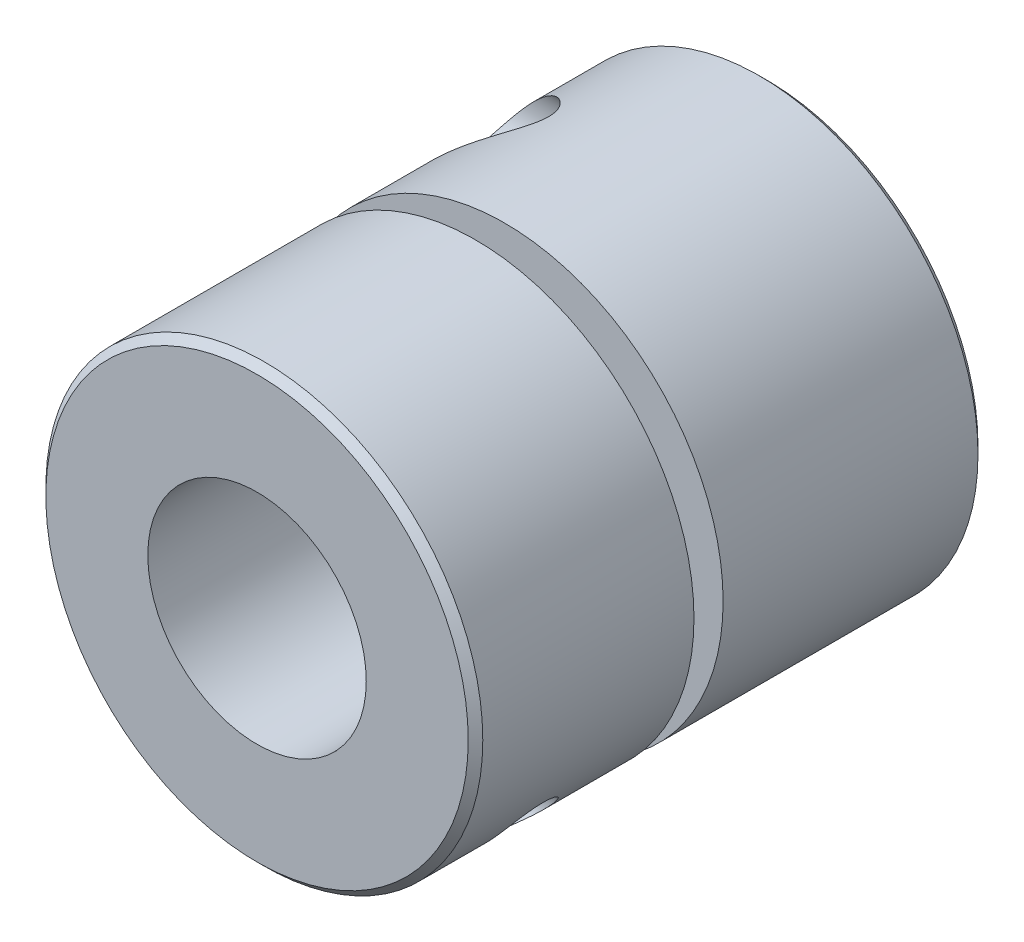
ISO-10303-21;
HEADER;
FILE_DESCRIPTION(('STEP AP214'),'2;1');
FILE_NAME('part.step','',(''),(''),'','','');
FILE_SCHEMA(('AUTOMOTIVE_DESIGN { 1 0 10303 214 1 1 1 1 }'));
ENDSEC;
DATA;
#1=APPLICATION_CONTEXT('core data for automotive mechanical design processes');
#2=APPLICATION_PROTOCOL_DEFINITION('international standard','automotive_design',2000,#1);
#3=PRODUCT_CONTEXT('',#1,'mechanical');
#4=PRODUCT('Part','Part','',(#3));
#5=PRODUCT_RELATED_PRODUCT_CATEGORY('part','',(#4));
#6=PRODUCT_DEFINITION_FORMATION('','',#4);
#7=PRODUCT_DEFINITION_CONTEXT('part definition',#1,'design');
#8=PRODUCT_DEFINITION('design','',#6,#7);
#9=PRODUCT_DEFINITION_SHAPE('','',#8);
#10=(LENGTH_UNIT() NAMED_UNIT(*) SI_UNIT(.MILLI.,.METRE.));
#11=(NAMED_UNIT(*) PLANE_ANGLE_UNIT() SI_UNIT($,.RADIAN.));
#12=(NAMED_UNIT(*) SI_UNIT($,.STERADIAN.) SOLID_ANGLE_UNIT());
#13=UNCERTAINTY_MEASURE_WITH_UNIT(LENGTH_MEASURE(1.E-05),#10,'distance_accuracy_value','');
#14=(GEOMETRIC_REPRESENTATION_CONTEXT(3) GLOBAL_UNCERTAINTY_ASSIGNED_CONTEXT((#13)) GLOBAL_UNIT_ASSIGNED_CONTEXT((#10,
#11,#12)) REPRESENTATION_CONTEXT('',''));
#15=CARTESIAN_POINT('',(0.,0.,0.));
#16=DIRECTION('',(0.,0.,1.));
#17=DIRECTION('',(1.,0.,0.));
#18=AXIS2_PLACEMENT_3D('',#15,#16,#17);
#19=CARTESIAN_POINT('',(0.,0.,35.));
#20=DIRECTION('',(0.,0.,-1.));
#21=DIRECTION('',(-1.,0.,0.));
#22=AXIS2_PLACEMENT_3D('',#19,#20,#21);
#23=CYLINDRICAL_SURFACE('',#22,15.);
#24=CARTESIAN_POINT('',(0.,0.,0.499999999999994));
#25=DIRECTION('',(0.,0.,1.));
#26=DIRECTION('',(1.,0.,0.));
#27=AXIS2_PLACEMENT_3D('',#24,#25,#26);
#28=CIRCLE('',#27,15.);
#29=CARTESIAN_POINT('',(15.,0.,0.499999999999994));
#30=VERTEX_POINT('',#29);
#31=EDGE_CURVE('E51',#30,#30,#28,.T.);
#32=ORIENTED_EDGE('',*,*,#31,.T.);
#33=EDGE_LOOP('',(#32));
#34=FACE_BOUND('',#33,.T.);
#35=CARTESIAN_POINT('',(-11.0020331092018,10.195845598283,12.3565111412236));
#36=CARTESIAN_POINT('',(-11.1031395331951,10.0867470674364,12.3565103758588));
#37=CARTESIAN_POINT('',(-11.2026089002651,9.97615051475666,12.3514126209323));
#38=CARTESIAN_POINT('',(-11.3976937692971,9.75266899524826,12.3301533493512));
#39=CARTESIAN_POINT('',(-11.4933105579534,9.63978481170017,12.3139955595369));
#40=CARTESIAN_POINT('',(-11.6799218690886,9.41280816138534,12.269748374949));
#41=CARTESIAN_POINT('',(-11.7709236211367,9.29871794552984,12.2416783307576));
#42=CARTESIAN_POINT('',(-11.9477210012551,9.07043819317876,12.1727879698587));
#43=CARTESIAN_POINT('',(-12.0335181984847,8.95624869725375,12.1319715192058));
#44=CARTESIAN_POINT('',(-12.23963714871,8.67379495606869,12.0135329683673));
#45=CARTESIAN_POINT('',(-12.3564536173244,8.50624392272276,11.9276651409229));
#46=CARTESIAN_POINT('',(-12.5199540052844,8.26199028005789,11.7753218685903));
#47=CARTESIAN_POINT('',(-12.5725204220144,8.18171779355686,11.720588211023));
#48=CARTESIAN_POINT('',(-12.6734969091651,8.02441095306445,11.6032332118353));
#49=CARTESIAN_POINT('',(-12.7219090005742,7.94737503397073,11.5406157425176));
#50=CARTESIAN_POINT('',(-12.8146777070632,7.79691726440608,11.4070683367229));
#51=CARTESIAN_POINT('',(-12.8590001007126,7.72352793363658,11.3360779172805));
#52=CARTESIAN_POINT('',(-12.9429148582408,7.58206530726733,11.1864773561074));
#53=CARTESIAN_POINT('',(-12.9825095014486,7.51398945547626,11.107870919571));
#54=CARTESIAN_POINT('',(-13.0567930373351,7.38415550598129,10.9434632192253));
#55=CARTESIAN_POINT('',(-13.0914826610948,7.32239646715255,10.85766303067));
#56=CARTESIAN_POINT('',(-13.1558116390279,7.20618026714733,10.6794786018447));
#57=CARTESIAN_POINT('',(-13.185451710145,7.15172206961994,10.587095298902));
#58=CARTESIAN_POINT('',(-13.2363053984264,7.05710611906104,10.408056453216));
#59=CARTESIAN_POINT('',(-13.2581045129419,7.01601546328598,10.3220585408513));
#60=CARTESIAN_POINT('',(-13.2976838581459,6.9407070743419,10.1461730547712));
#61=CARTESIAN_POINT('',(-13.3154627504944,6.90649163036569,10.0562841975824));
#62=CARTESIAN_POINT('',(-13.346950214721,6.84544404663353,9.87341276883781));
#63=CARTESIAN_POINT('',(-13.3606619486822,6.81860617225303,9.78043266350758));
#64=CARTESIAN_POINT('',(-13.3840219607347,6.77263669142825,9.59207824046414));
#65=CARTESIAN_POINT('',(-13.3936688168113,6.75350778191006,9.49670309723863));
#66=CARTESIAN_POINT('',(-13.4153064733052,6.71048645611287,9.22313506436802));
#67=CARTESIAN_POINT('',(-13.4224150447315,6.69617756777647,9.04291988616605));
#68=CARTESIAN_POINT('',(-13.4227392735388,6.69552470348761,8.68255330550517));
#69=CARTESIAN_POINT('',(-13.4159580784298,6.70917439194305,8.50240189784794));
#70=CARTESIAN_POINT('',(-13.3888241730662,6.76315464666682,8.15116644633402));
#71=CARTESIAN_POINT('',(-13.3687649606675,6.8029080660479,7.97997086675997));
#72=CARTESIAN_POINT('',(-13.3154191474264,6.90673520314564,7.64732959913097));
#73=CARTESIAN_POINT('',(-13.2821327303311,6.97080858301856,7.4858837756722));
#74=CARTESIAN_POINT('',(-13.2018713481645,7.12165495511355,7.17431383402388));
#75=CARTESIAN_POINT('',(-13.154684960411,7.20877625506642,7.02441340546248));
#76=CARTESIAN_POINT('',(-13.0472688557942,7.4014125277274,6.74218899961281));
#77=CARTESIAN_POINT('',(-12.987036988999,7.50693053170479,6.6098679252581));
#78=CARTESIAN_POINT('',(-12.8503753979955,7.73866467348339,6.35786305470742));
#79=CARTESIAN_POINT('',(-12.7732071226608,7.86572789558838,6.2393625107288));
#80=CARTESIAN_POINT('',(-12.6062599424952,8.13060454402931,6.02564899395779));
#81=CARTESIAN_POINT('',(-12.5164768587495,8.26842152601498,5.93044376698737));
#82=CARTESIAN_POINT('',(-12.3145943196537,8.56661003631863,5.75343771132669));
#83=CARTESIAN_POINT('',(-12.2011132012246,8.72773613788905,5.6745000912034));
#84=CARTESIAN_POINT('',(-11.9623081320837,9.05228268992908,5.54397313057368));
#85=CARTESIAN_POINT('',(-11.8369758825093,9.21570467890472,5.49240312410229));
#86=CARTESIAN_POINT('',(-11.6094589608601,9.49972690431948,5.42415583112466));
#87=CARTESIAN_POINT('',(-11.5093851668243,9.62075511927761,5.40196383552416));
#88=CARTESIAN_POINT('',(-11.3045792410568,9.86059565487537,5.37050513203004));
#89=CARTESIAN_POINT('',(-11.1998453401152,9.97940710920182,5.36124337706013));
#90=CARTESIAN_POINT('',(-10.9863528763697,10.2139732117259,5.35458855230133));
#91=CARTESIAN_POINT('',(-10.8775887122869,10.3297231908017,5.35721266593951));
#92=CARTESIAN_POINT('',(-10.6568260884147,10.5573297176085,5.37335898821368));
#93=CARTESIAN_POINT('',(-10.5448268188305,10.6691852747817,5.38688394868999));
#94=CARTESIAN_POINT('',(-10.2818627846389,10.9236733444856,5.42987324188586));
#95=CARTESIAN_POINT('',(-10.1299196329475,11.06467323312,5.4630580644798));
#96=CARTESIAN_POINT('',(-9.82271717636426,11.3382793486916,5.54512807898817));
#97=CARTESIAN_POINT('',(-9.66745660304501,11.4708822853396,5.59401938036345));
#98=CARTESIAN_POINT('',(-9.35451836471184,11.7274898237226,5.70631685395564));
#99=CARTESIAN_POINT('',(-9.19683623831,11.8514754185735,5.7697538628122));
#100=CARTESIAN_POINT('',(-8.88063945828828,12.0902219408835,5.91023798320565));
#101=CARTESIAN_POINT('',(-8.72212506107457,12.204985550024,5.98728111719666));
#102=CARTESIAN_POINT('',(-8.43118334448384,12.4073076139804,6.14120724739157));
#103=CARTESIAN_POINT('',(-8.2986762107262,12.4962668649216,6.21610779319468));
#104=CARTESIAN_POINT('',(-8.03507094313023,12.6673716623416,6.37553589668246));
#105=CARTESIAN_POINT('',(-7.90397258060852,12.7495183296953,6.46006186524325));
#106=CARTESIAN_POINT('',(-7.64514487847878,12.90637663986,6.63905113864454));
#107=CARTESIAN_POINT('',(-7.51740344961792,12.9811188138625,6.7334700240577));
#108=CARTESIAN_POINT('',(-7.266889524536,13.122993532535,6.93378353478326));
#109=CARTESIAN_POINT('',(-7.14411210785405,13.1901337375912,7.03966639364851));
#110=CARTESIAN_POINT('',(-6.93972048211783,13.2984866331764,7.2340629349267));
#111=CARTESIAN_POINT('',(-6.85609584674312,13.3417417129369,7.31930797879928));
#112=CARTESIAN_POINT('',(-6.6953778153329,13.4231151247083,7.49841470773895));
#113=CARTESIAN_POINT('',(-6.61829467563666,13.4612254436165,7.59228946015128));
#114=CARTESIAN_POINT('',(-6.47352548715156,13.531444770454,7.79112381782959));
#115=CARTESIAN_POINT('',(-6.40596026587193,13.5634781432714,7.89620052679937));
#116=CARTESIAN_POINT('',(-6.28747039266371,13.6188105386912,8.11747286525808));
#117=CARTESIAN_POINT('',(-6.23648466350047,13.6421416673344,8.2336255976518));
#118=CARTESIAN_POINT('',(-6.17250530523691,13.6711730432716,8.43398053075024));
#119=CARTESIAN_POINT('',(-6.15247567757696,13.6801774898627,8.51542597233209));
#120=CARTESIAN_POINT('',(-6.1251976255848,13.6924135134478,8.68083915948511));
#121=CARTESIAN_POINT('',(-6.11793318032208,13.6956523266614,8.76480360870145));
#122=CARTESIAN_POINT('',(-6.11710510576914,13.6960222870312,8.93298102693263));
#123=CARTESIAN_POINT('',(-6.12356841072797,13.6931414272077,9.01719416017749));
#124=CARTESIAN_POINT('',(-6.14939558703659,13.6815613964159,9.18321777165154));
#125=CARTESIAN_POINT('',(-6.16877436001184,13.6728555045892,9.26502536043728));
#126=CARTESIAN_POINT('',(-6.2268983806718,13.6465034868568,9.45208694222117));
#127=CARTESIAN_POINT('',(-6.270023317516,13.6268068432512,9.55566617593781));
#128=CARTESIAN_POINT('',(-6.3700906080702,13.580315750902,9.75419524279034));
#129=CARTESIAN_POINT('',(-6.42707004897389,13.5535022330123,9.8491209574917));
#130=CARTESIAN_POINT('',(-6.54375024921656,13.4975212174931,10.021075349791));
#131=CARTESIAN_POINT('',(-6.60251911331427,13.4689062640072,10.0989340402164));
#132=CARTESIAN_POINT('',(-6.72535456987768,13.4079942848537,10.2488671090635));
#133=CARTESIAN_POINT('',(-6.78942552774113,13.3756942166499,10.3209366228969));
#134=CARTESIAN_POINT('',(-6.9214530791084,13.3078551698307,10.4600687978586));
#135=CARTESIAN_POINT('',(-6.98941734258005,13.2723097097627,10.5271209305887));
#136=CARTESIAN_POINT('',(-7.12809967617907,13.1983478801255,10.6566602873321));
#137=CARTESIAN_POINT('',(-7.19881876577103,13.1599304428105,10.7191457963169));
#138=CARTESIAN_POINT('',(-7.40985647236656,13.0429798899022,10.8970074164222));
#139=CARTESIAN_POINT('',(-7.55293901524958,12.9607710014491,11.0067129825068));
#140=CARTESIAN_POINT('',(-7.84311796446491,12.7872663922705,11.2129217045128));
#141=CARTESIAN_POINT('',(-7.99021755011621,12.6959633131371,11.3094140167724));
#142=CARTESIAN_POINT('',(-8.28652695575009,12.5045840689395,11.4903461402839));
#143=CARTESIAN_POINT('',(-8.43573979130662,12.4044940190159,11.5747663014732));
#144=CARTESIAN_POINT('',(-8.73456306379979,12.1959267065528,11.7316981919959));
#145=CARTESIAN_POINT('',(-8.8841735257328,12.0874489040776,11.8042091537712));
#146=CARTESIAN_POINT('',(-9.20370653356821,11.8464034133774,11.9464811955824));
#147=CARTESIAN_POINT('',(-9.37351631800918,11.7125964003602,12.0144104507935));
#148=CARTESIAN_POINT('',(-9.71067407658052,11.434621077991,12.1334447674432));
#149=CARTESIAN_POINT('',(-9.87802120220496,11.2904492937101,12.184544154094));
#150=CARTESIAN_POINT('',(-10.2082797841613,10.9927397282703,12.268080202679));
#151=CARTESIAN_POINT('',(-10.3712012364654,10.8392261307657,12.3005629603652));
#152=CARTESIAN_POINT('',(-10.6913472959351,10.5235697874343,12.3447717547405));
#153=CARTESIAN_POINT('',(-10.8485758104433,10.3614331562343,12.356512302879));
#154=CARTESIAN_POINT('',(-11.0020331092018,10.195845598283,12.3565111412236));
#155=B_SPLINE_CURVE_WITH_KNOTS('',3,(#35,#36,#37,#38,#39,#40,#41,#42,#43,#44,#45,#46,#47,#48,
#49,#50,#51,#52,#53,#54,#55,#56,#57,#58,#59,#60,#61,#62,#63,#64,#65,#66,#67,#68,#69,#70,#71,#72,
#73,#74,#75,#76,#77,#78,#79,#80,#81,#82,#83,#84,#85,#86,#87,#88,#89,#90,#91,#92,#93,#94,#95,#96,
#97,#98,#99,#100,#101,#102,#103,#104,#105,#106,#107,#108,#109,#110,#111,#112,#113,#114,#115,
#116,#117,#118,#119,#120,#121,#122,#123,#124,#125,#126,#127,#128,#129,#130,#131,#132,#133,#134,
#135,#136,#137,#138,#139,#140,#141,#142,#143,#144,#145,#146,#147,#148,#149,#150,#151,#152,#153,
#154),.UNSPECIFIED.,.T.,.F.,(4,2,2,2,2,2,2,2,2,2,2,2,2,2,2,2,2,2,2,2,2,2,2,2,2,2,2,2,2,2,2,2,2,
2,2,2,2,2,2,2,2,2,2,2,2,2,2,2,2,2,2,2,2,2,2,2,2,2,2,4),(0.,0.446087320335412,0.892024398981024,
1.33723984182765,1.78232037933598,2.4438853785312,2.77495643296555,3.10586550454989,
3.4393311142137,3.77263529968082,4.10588975450379,4.4390968538153,4.73202388113014,
5.02504828134729,5.317844263891,5.61074259027358,6.15060986012823,6.69035480614498,
7.21855069323761,7.7467392431003,8.28341761482351,8.82018450005448,9.38818278271246,
9.95636967207857,10.5909010586713,11.2258801195002,11.701083238605,12.1764683341857,
12.6525409142537,13.128733713074,13.757625480754,14.3867621697394,15.0172451548881,
15.6475441320041,16.1760790335589,16.7045268020002,17.2306960021133,17.7563301799996,
18.1369302981833,18.5181165353073,18.9037738672411,19.2879939415463,19.5400207457832,
19.7917310174868,20.0439356082947,20.2964316929604,20.6362421998737,20.9769725603022,
21.2815115640895,21.5863038488052,21.8917187431406,22.1972477550217,22.7908022041292,
23.3848408804285,23.9798357388555,24.5748689301734,25.2538659328272,25.9330916496023,
26.610628220059,27.2876905914235),.UNSPECIFIED.);
#156=CARTESIAN_POINT('',(-11.0020331092018,10.195845598283,12.3565111412236));
#157=VERTEX_POINT('',#156);
#158=EDGE_CURVE('E106',#157,#157,#155,.T.);
#159=ORIENTED_EDGE('',*,*,#158,.T.);
#160=EDGE_LOOP('',(#159));
#161=FACE_BOUND('',#160,.T.);
#162=CARTESIAN_POINT('',(0.,0.,18.));
#163=DIRECTION('',(0.,0.,1.));
#164=DIRECTION('',(1.,0.,0.));
#165=AXIS2_PLACEMENT_3D('',#162,#163,#164);
#166=CIRCLE('',#165,15.);
#167=CARTESIAN_POINT('',(15.,0.,18.));
#168=VERTEX_POINT('',#167);
#169=EDGE_CURVE('E132',#168,#168,#166,.T.);
#170=ORIENTED_EDGE('',*,*,#169,.F.);
#171=EDGE_LOOP('',(#170));
#172=FACE_BOUND('',#171,.T.);
#173=ADVANCED_FACE('F35',(#34,#161,#172),#23,.T.);
#174=CARTESIAN_POINT('',(0.,0.,35.));
#175=DIRECTION('',(0.,0.,-1.));
#176=DIRECTION('',(-1.,0.,0.));
#177=AXIS2_PLACEMENT_3D('',#174,#175,#176);
#178=CYLINDRICAL_SURFACE('',#177,4.);
#179=CARTESIAN_POINT('',(0.,0.,0.));
#180=DIRECTION('',(0.,0.,1.));
#181=DIRECTION('',(1.,0.,0.));
#182=AXIS2_PLACEMENT_3D('',#179,#180,#181);
#183=CIRCLE('',#182,4.);
#184=CARTESIAN_POINT('',(4.,0.,0.));
#185=VERTEX_POINT('',#184);
#186=EDGE_CURVE('E56',#185,#185,#183,.T.);
#187=ORIENTED_EDGE('',*,*,#186,.F.);
#188=EDGE_LOOP('',(#187));
#189=FACE_BOUND('',#188,.T.);
#190=CARTESIAN_POINT('',(0.,0.,20.));
#191=DIRECTION('',(0.,0.,1.));
#192=DIRECTION('',(1.,0.,0.));
#193=AXIS2_PLACEMENT_3D('',#190,#191,#192);
#194=CIRCLE('',#193,4.);
#195=CARTESIAN_POINT('',(4.,0.,20.));
#196=VERTEX_POINT('',#195);
#197=EDGE_CURVE('E117',#196,#196,#194,.T.);
#198=ORIENTED_EDGE('',*,*,#197,.T.);
#199=EDGE_LOOP('',(#198));
#200=FACE_BOUND('',#199,.T.);
#201=ADVANCED_FACE('F148',(#189,#200),#178,.F.);
#202=CARTESIAN_POINT('',(0.,0.,35.));
#203=DIRECTION('',(0.,0.,1.));
#204=DIRECTION('',(1.,0.,0.));
#205=AXIS2_PLACEMENT_3D('',#202,#203,#204);
#206=PLANE('',#205);
#207=CARTESIAN_POINT('',(0.,0.,35.));
#208=DIRECTION('',(0.,0.,1.));
#209=DIRECTION('',(1.,0.,0.));
#210=AXIS2_PLACEMENT_3D('',#207,#208,#209);
#211=CIRCLE('',#210,14.5);
#212=CARTESIAN_POINT('',(14.5,0.,35.));
#213=VERTEX_POINT('',#212);
#214=EDGE_CURVE('E43',#213,#213,#211,.T.);
#215=ORIENTED_EDGE('',*,*,#214,.T.);
#216=EDGE_LOOP('',(#215));
#217=FACE_BOUND('',#216,.T.);
#218=CARTESIAN_POINT('',(0.,0.,35.));
#219=DIRECTION('',(0.,0.,1.));
#220=DIRECTION('',(1.,0.,0.));
#221=AXIS2_PLACEMENT_3D('',#218,#219,#220);
#222=CIRCLE('',#221,7.5);
#223=CARTESIAN_POINT('',(7.5,0.,35.));
#224=VERTEX_POINT('',#223);
#225=EDGE_CURVE('E123',#224,#224,#222,.T.);
#226=ORIENTED_EDGE('',*,*,#225,.F.);
#227=EDGE_LOOP('',(#226));
#228=FACE_BOUND('',#227,.T.);
#229=ADVANCED_FACE('F153',(#217,#228),#206,.T.);
#230=CARTESIAN_POINT('',(0.,0.,0.));
#231=DIRECTION('',(0.,0.,1.));
#232=DIRECTION('',(1.,0.,0.));
#233=AXIS2_PLACEMENT_3D('',#230,#231,#232);
#234=PLANE('',#233);
#235=CARTESIAN_POINT('',(0.,0.,0.));
#236=DIRECTION('',(0.,0.,1.));
#237=DIRECTION('',(1.,0.,0.));
#238=AXIS2_PLACEMENT_3D('',#235,#236,#237);
#239=CIRCLE('',#238,14.5);
#240=CARTESIAN_POINT('',(14.5,0.,0.));
#241=VERTEX_POINT('',#240);
#242=EDGE_CURVE('E47',#241,#241,#239,.F.);
#243=ORIENTED_EDGE('',*,*,#242,.T.);
#244=EDGE_LOOP('',(#243));
#245=FACE_BOUND('',#244,.T.);
#246=ORIENTED_EDGE('',*,*,#186,.T.);
#247=EDGE_LOOP('',(#246));
#248=FACE_BOUND('',#247,.T.);
#249=ADVANCED_FACE('F159',(#245,#248),#234,.F.);
#250=CARTESIAN_POINT('',(0.,0.,34.5));
#251=DIRECTION('',(0.,0.,1.));
#252=DIRECTION('',(1.,0.,0.));
#253=AXIS2_PLACEMENT_3D('',#250,#251,#252);
#254=CIRCLE('',#253,15.);
#255=CARTESIAN_POINT('',(15.,0.,34.5));
#256=VERTEX_POINT('',#255);
#257=EDGE_CURVE('E10',#256,#256,#254,.F.);
#258=ORIENTED_EDGE('',*,*,#257,.T.);
#259=EDGE_LOOP('',(#258));
#260=FACE_BOUND('',#259,.T.);
#261=CARTESIAN_POINT('',(-10.9516179632729,-10.2499787310276,25.8779257609572));
#262=CARTESIAN_POINT('',(-11.0671926888501,-10.1264894017646,25.8779236409298));
#263=CARTESIAN_POINT('',(-11.1807456858665,-10.0009522719894,25.8893368889103));
#264=CARTESIAN_POINT('',(-11.4013316571759,-9.74872577209425,25.9375095698619));
#265=CARTESIAN_POINT('',(-11.5083629682304,-9.62203611743313,25.9742754393601));
#266=CARTESIAN_POINT('',(-11.693863847144,-9.39525970530383,26.0664260605147));
#267=CARTESIAN_POINT('',(-11.7739505452686,-9.29459405207946,26.1170973964391));
#268=CARTESIAN_POINT('',(-11.9257260526562,-9.09902792193606,26.2382613793753));
#269=CARTESIAN_POINT('',(-11.9974266514485,-9.00411944400374,26.3087257143814));
#270=CARTESIAN_POINT('',(-12.1189030659399,-8.83973048495967,26.4562212891012));
#271=CARTESIAN_POINT('',(-12.1703350906434,-8.76866688841244,26.5301141423214));
#272=CARTESIAN_POINT('',(-12.264406986073,-8.63660184394378,26.691392952806));
#273=CARTESIAN_POINT('',(-12.3070486353157,-8.57559836110601,26.778776174356));
#274=CARTESIAN_POINT('',(-12.3823173215258,-8.46656139654996,26.9661960613555));
#275=CARTESIAN_POINT('',(-12.4148727729048,-8.41862090439305,27.0663163658086));
#276=CARTESIAN_POINT('',(-12.4681876796833,-8.33946080154334,27.2758994646919));
#277=CARTESIAN_POINT('',(-12.488955757907,-8.30822896891761,27.3853553622502));
#278=CARTESIAN_POINT('',(-12.515957252284,-8.26748631614226,27.595563066942));
#279=CARTESIAN_POINT('',(-12.5236806821954,-8.25575181847005,27.6956972569552));
#280=CARTESIAN_POINT('',(-12.5290902006382,-8.24754091825075,27.8968414173324));
#281=CARTESIAN_POINT('',(-12.5267808170597,-8.25105763270648,27.9978509720997));
#282=CARTESIAN_POINT('',(-12.5126864808879,-8.27241294863443,28.1911182058998));
#283=CARTESIAN_POINT('',(-12.5015106864095,-8.2893307306521,28.2835251026876));
#284=CARTESIAN_POINT('',(-12.470814151126,-8.33543971098473,28.4637524411374));
#285=CARTESIAN_POINT('',(-12.4512934003129,-8.3646309240189,28.551572877299));
#286=CARTESIAN_POINT('',(-12.4038789080888,-8.4347860334527,28.7228325698585));
#287=CARTESIAN_POINT('',(-12.3757764097648,-8.47604221615607,28.8060933368774));
#288=CARTESIAN_POINT('',(-12.3122174785545,-8.56810510129952,28.9640511752763));
#289=CARTESIAN_POINT('',(-12.2767589393145,-8.61891453885964,29.0387457842601));
#290=CARTESIAN_POINT('',(-12.1954199016764,-8.7336790820006,29.1857455149546));
#291=CARTESIAN_POINT('',(-12.1488451653285,-8.79844651915317,29.2570291846677));
#292=CARTESIAN_POINT('',(-12.049037459014,-8.93464335632938,29.3874974282902));
#293=CARTESIAN_POINT('',(-11.9958002653061,-9.00607697508373,29.4466742636664));
#294=CARTESIAN_POINT('',(-11.8598450104857,-9.18484601234299,29.5756512329706));
#295=CARTESIAN_POINT('',(-11.7742364267928,-9.29450102342876,29.6392200509423));
#296=CARTESIAN_POINT('',(-11.5945069624318,-9.5177777565181,29.7431643728873));
#297=CARTESIAN_POINT('',(-11.5003701271165,-9.63140665857766,29.7834953214775));
#298=CARTESIAN_POINT('',(-11.2787985145525,-9.89066176458419,29.8511196532286));
#299=CARTESIAN_POINT('',(-11.149399932426,-10.0363724897643,29.8716387137897));
#300=CARTESIAN_POINT('',(-10.8844980656057,-10.3230808267684,29.8817443804405));
#301=CARTESIAN_POINT('',(-10.748989341126,-10.4640740360683,29.8713028650021));
#302=CARTESIAN_POINT('',(-10.4729717819754,-10.74036825595,29.8220232044489));
#303=CARTESIAN_POINT('',(-10.3324179463049,-10.8755464590826,29.7827454560668));
#304=CARTESIAN_POINT('',(-10.122138220793,-11.0702987399964,29.7032984109962));
#305=CARTESIAN_POINT('',(-10.0521100688007,-11.1339031811754,29.6733789097182));
#306=CARTESIAN_POINT('',(-9.91274511034105,-11.2581614327967,29.6066647929145));
#307=CARTESIAN_POINT('',(-9.84340816603279,-11.3188158412878,29.5698715782543));
#308=CARTESIAN_POINT('',(-9.66405204669931,-11.4728924236217,29.464668598617));
#309=CARTESIAN_POINT('',(-9.55498820161344,-11.5637604613218,29.3906547994635));
#310=CARTESIAN_POINT('',(-9.39682151199906,-11.6920654271812,29.2649914874544));
#311=CARTESIAN_POINT('',(-9.34502550264869,-11.7334846031475,29.2206857562754));
#312=CARTESIAN_POINT('',(-9.24391657019897,-11.8133035563174,29.126849137805));
#313=CARTESIAN_POINT('',(-9.1946024417608,-11.8517048043832,29.07732082378));
#314=CARTESIAN_POINT('',(-9.08748263718176,-11.9341225824233,28.9596084442414));
#315=CARTESIAN_POINT('',(-9.03062153246558,-11.9771551898464,28.8898504410154));
#316=CARTESIAN_POINT('',(-8.9248496568278,-12.0561769639313,28.7409046367934));
#317=CARTESIAN_POINT('',(-8.87592729132307,-12.092176418535,28.6617308860537));
#318=CARTESIAN_POINT('',(-8.79992365430485,-12.1475521156391,28.5134717313405));
#319=CARTESIAN_POINT('',(-8.77041075685398,-12.168846915602,28.4463708830063));
#320=CARTESIAN_POINT('',(-8.72045557295662,-12.204696015721,28.3071457359172));
#321=CARTESIAN_POINT('',(-8.70000326162902,-12.2192577662919,28.2350270917696));
#322=CARTESIAN_POINT('',(-8.67011052773948,-12.240487679703,28.0865800136744));
#323=CARTESIAN_POINT('',(-8.66077961689904,-12.2470773513388,28.0102173405585));
#324=CARTESIAN_POINT('',(-8.65475463335395,-12.2513363446853,27.8567546376799));
#325=CARTESIAN_POINT('',(-8.65805386283443,-12.2490103943858,27.7796550203552));
#326=CARTESIAN_POINT('',(-8.67545707711104,-12.236687614782,27.6385834318875));
#327=CARTESIAN_POINT('',(-8.68796270448678,-12.227825216953,27.5743001501164));
#328=CARTESIAN_POINT('',(-8.72076492370359,-12.2044526622841,27.4488466959525));
#329=CARTESIAN_POINT('',(-8.74106581254888,-12.189939390435,27.3876782616664));
#330=CARTESIAN_POINT('',(-8.79889853650504,-12.1482983163417,27.2419343006994));
#331=CARTESIAN_POINT('',(-8.84005857788651,-12.1184400535801,27.1595874003801));
#332=CARTESIAN_POINT('',(-8.93190308488905,-12.050907864054,27.0039155898692));
#333=CARTESIAN_POINT('',(-8.98261148328433,-12.0132142729658,26.9306141331709));
#334=CARTESIAN_POINT('',(-9.12078284421523,-11.9089195744381,26.7538227406142));
#335=CARTESIAN_POINT('',(-9.21287566778299,-11.8379845614103,26.6565451517286));
#336=CARTESIAN_POINT('',(-9.40556674814668,-11.6854846267743,26.480456065114));
#337=CARTESIAN_POINT('',(-9.506187169474,-11.6038916863004,26.401694829659));
#338=CARTESIAN_POINT('',(-9.68256362230545,-11.456751772797,26.2810631728572));
#339=CARTESIAN_POINT('',(-9.75725012655901,-11.3932431284687,26.2350720742888));
#340=CARTESIAN_POINT('',(-9.90795367257832,-11.2624351790345,26.1513777731713));
#341=CARTESIAN_POINT('',(-9.98397134489204,-11.1951340420807,26.1136786196532));
#342=CARTESIAN_POINT('',(-10.2125643169364,-10.9884227093678,26.0129379349796));
#343=CARTESIAN_POINT('',(-10.3660955625224,-10.8438602982384,25.9619769089831));
#344=CARTESIAN_POINT('',(-10.5913254667931,-10.6223572436478,25.911516340927));
#345=CARTESIAN_POINT('',(-10.6641662646622,-10.5492323537074,25.8990347190225));
#346=CARTESIAN_POINT('',(-10.8087986040386,-10.4009891187388,25.8822398032261));
#347=CARTESIAN_POINT('',(-10.880590073988,-10.3258706387345,25.8779270638465));
#348=CARTESIAN_POINT('',(-10.9516179632729,-10.2499787310276,25.8779257609572));
#349=B_SPLINE_CURVE_WITH_KNOTS('',3,(#261,#262,#263,#264,#265,#266,#267,#268,#269,#270,#271,
#272,#273,#274,#275,#276,#277,#278,#279,#280,#281,#282,#283,#284,#285,#286,#287,#288,#289,#290,
#291,#292,#293,#294,#295,#296,#297,#298,#299,#300,#301,#302,#303,#304,#305,#306,#307,#308,#309,
#310,#311,#312,#313,#314,#315,#316,#317,#318,#319,#320,#321,#322,#323,#324,#325,#326,#327,#328,
#329,#330,#331,#332,#333,#334,#335,#336,#337,#338,#339,#340,#341,#342,#343,#344,#345,#346,#347,
#348),.UNSPECIFIED.,.T.,.F.,(4,2,2,2,2,2,2,2,2,2,2,2,2,2,2,2,2,2,2,2,2,2,2,2,2,2,2,2,2,2,2,2,2,
2,2,2,2,2,2,2,2,2,2,4),(0.,0.507123803011302,1.01437640210979,1.42762029699624,1.84027606977385,
2.18297533239193,2.52560519003087,2.8706138810326,3.21536986124889,3.51711682594134,
3.81872762392755,4.1012433351256,4.38375938513862,4.67378448695146,4.96389275044319,
5.28360195624834,5.60351488197855,6.05985263461886,6.51706246450713,7.10180090891538,
7.68707063459691,8.28145298961177,8.57887235989302,8.87623118198282,9.35478373714138,
9.59385190456644,9.83280282413048,10.1312739555039,10.4293051660526,10.6574867685923,
10.8854152703293,11.1155701009484,11.3456028964343,11.5430189084144,11.7405438991696,
12.0292458461045,12.3186812907634,12.7709259861174,13.2243844707844,13.5488451604775,
13.8734639372121,14.520902331497,14.8325404369516,15.1441996959648),.UNSPECIFIED.);
#350=CARTESIAN_POINT('',(-10.9516179632729,-10.2499787310276,25.8779257609572));
#351=VERTEX_POINT('',#350);
#352=EDGE_CURVE('E57',#351,#351,#349,.T.);
#353=ORIENTED_EDGE('',*,*,#352,.T.);
#354=EDGE_LOOP('',(#353));
#355=FACE_BOUND('',#354,.T.);
#356=CARTESIAN_POINT('',(10.9516179632729,-10.2499787310276,25.8779257609572));
#357=CARTESIAN_POINT('',(10.8032838009094,-10.4084558866627,25.877922088454));
#358=CARTESIAN_POINT('',(10.6512390032438,-10.5639328556215,25.8967198092539));
#359=CARTESIAN_POINT('',(10.4213026721264,-10.7892638897681,25.9504438890929));
#360=CARTESIAN_POINT('',(10.344104303648,-10.8632764712043,25.9727152231014));
#361=CARTESIAN_POINT('',(10.1896796387412,-11.0082510710829,26.0256377268647));
#362=CARTESIAN_POINT('',(10.1124533538759,-11.0792138364532,26.056286831136));
#363=CARTESIAN_POINT('',(9.95787564462266,-11.2183621586758,26.1262513392814));
#364=CARTESIAN_POINT('',(9.88053075544631,-11.2865126583303,26.1656507032936));
#365=CARTESIAN_POINT('',(9.72726686003296,-11.4188671593369,26.253119423721));
#366=CARTESIAN_POINT('',(9.65134861081948,-11.4830691043512,26.3011932472267));
#367=CARTESIAN_POINT('',(9.50244875796342,-11.6065832666756,26.4061372540117));
#368=CARTESIAN_POINT('',(9.42945412081642,-11.6659188129174,26.4629611911817));
#369=CARTESIAN_POINT('',(9.28758656901857,-11.7791742322176,26.5861992849291));
#370=CARTESIAN_POINT('',(9.21870802625761,-11.8331015719502,26.6525999019128));
#371=CARTESIAN_POINT('',(9.09694586797887,-11.9268851377101,26.7854128783616));
#372=CARTESIAN_POINT('',(9.04319999671719,-11.9676442487014,26.8503859017513));
#373=CARTESIAN_POINT('',(8.9424477964238,-12.0431132045912,26.9886235722028));
#374=CARTESIAN_POINT('',(8.89543582946382,-12.0778281152783,27.0618811899638));
#375=CARTESIAN_POINT('',(8.8176506007175,-12.1347023055941,27.2050219728659));
#376=CARTESIAN_POINT('',(8.78549236567551,-12.1579709549497,27.2736965813878));
#377=CARTESIAN_POINT('',(8.73058700083675,-12.1974589036404,27.4166350304955));
#378=CARTESIAN_POINT('',(8.7078252542543,-12.213689153617,27.4908899761996));
#379=CARTESIAN_POINT('',(8.67680033707856,-12.2357444293493,27.631090465005));
#380=CARTESIAN_POINT('',(8.66679199700891,-12.2428246463731,27.6964470860585));
#381=CARTESIAN_POINT('',(8.65601019160894,-12.250450437381,27.8282889202949));
#382=CARTESIAN_POINT('',(8.65523134199023,-12.2509998213148,27.8947734528039));
#383=CARTESIAN_POINT('',(8.66298059310161,-12.2455210618053,28.0268514672986));
#384=CARTESIAN_POINT('',(8.67150123080669,-12.2394981927275,28.0924456210892));
#385=CARTESIAN_POINT('',(8.69700177772493,-12.2213910651478,28.2210969713103));
#386=CARTESIAN_POINT('',(8.71398896262324,-12.2093015932801,28.2841519352433));
#387=CARTESIAN_POINT('',(8.7623104425583,-12.1746896903642,28.428136373864));
#388=CARTESIAN_POINT('',(8.79658998985025,-12.1499929126073,28.5075465825384));
#389=CARTESIAN_POINT('',(8.87464919773033,-12.0930948776916,28.6586153618055));
#390=CARTESIAN_POINT('',(8.91845030484707,-12.0608766668119,28.7302558767092));
#391=CARTESIAN_POINT('',(9.0379026612306,-11.9718162021367,28.9021524270869));
#392=CARTESIAN_POINT('',(9.11805265956397,-11.9110244355208,28.9971993324995));
#393=CARTESIAN_POINT('',(9.28727365861973,-11.7795636426274,29.1710941817913));
#394=CARTESIAN_POINT('',(9.37636506099338,-11.7088718752997,29.2499037670923));
#395=CARTESIAN_POINT('',(9.53669626355918,-11.5783984318479,29.3750182255888));
#396=CARTESIAN_POINT('',(9.60684590215661,-11.5202935960852,29.4245275759038));
#397=CARTESIAN_POINT('',(9.74897591152931,-11.4002683934473,29.5157663976623));
#398=CARTESIAN_POINT('',(9.82095712275043,-11.3383462557018,29.5574922215901));
#399=CARTESIAN_POINT('',(9.96595671071533,-11.2111114085958,29.6334064499106));
#400=CARTESIAN_POINT('',(10.0389756508679,-11.1457968019798,29.6675905792583));
#401=CARTESIAN_POINT('',(10.1854114085425,-11.0121401073162,29.7284675513703));
#402=CARTESIAN_POINT('',(10.2588283660321,-10.9437968841852,29.7551575574735));
#403=CARTESIAN_POINT('',(10.4071256723159,-10.8028890243927,29.8014400320235));
#404=CARTESIAN_POINT('',(10.4820025472654,-10.7302645029057,29.8208628081707));
#405=CARTESIAN_POINT('',(10.6310304568306,-10.5826385693287,29.8515075040467));
#406=CARTESIAN_POINT('',(10.7051815032433,-10.507637195954,29.8627295572811));
#407=CARTESIAN_POINT('',(10.9256308354572,-10.2798291320515,29.8834995656638));
#408=CARTESIAN_POINT('',(11.0702762916488,-10.1238858598557,29.8802627866701));
#409=CARTESIAN_POINT('',(11.3161087733921,-9.84739995385538,29.8406852080938));
#410=CARTESIAN_POINT('',(11.4193268737483,-9.72744542167777,29.8125644731453));
#411=CARTESIAN_POINT('',(11.6180030030412,-9.48925129064083,29.7318543200968));
#412=CARTESIAN_POINT('',(11.7134706048795,-9.37100972911567,29.6792956433064));
#413=CARTESIAN_POINT('',(11.8757073091773,-9.16413236283019,29.5608339906998));
#414=CARTESIAN_POINT('',(11.9444033048654,-9.07429405037233,29.4996807463989));
#415=CARTESIAN_POINT('',(12.0731166123794,-8.90232234769641,29.359837953928));
#416=CARTESIAN_POINT('',(12.1331432136667,-8.82018074393469,29.2811674092736));
#417=CARTESIAN_POINT('',(12.2339056151093,-8.67973738420024,29.1204531841711));
#418=CARTESIAN_POINT('',(12.2761906110972,-8.61971811531866,29.0408872503777));
#419=CARTESIAN_POINT('',(12.3519455078183,-8.51080760075536,28.8706381149124));
#420=CARTESIAN_POINT('',(12.3854180251979,-8.46191305245148,28.7799582249999));
#421=CARTESIAN_POINT('',(12.4425385266246,-8.37770017896917,28.5889278241124));
#422=CARTESIAN_POINT('',(12.4661314859139,-8.34245797061828,28.4885268871211));
#423=CARTESIAN_POINT('',(12.5022661260868,-8.28821010577002,28.2815236622272));
#424=CARTESIAN_POINT('',(12.5148130564604,-8.26919673684628,28.1749243457342));
#425=CARTESIAN_POINT('',(12.5276475973234,-8.24973688254605,27.9702410561008));
#426=CARTESIAN_POINT('',(12.5290438410492,-8.24761146994365,27.8723823587377));
#427=CARTESIAN_POINT('',(12.5224366275614,-8.25764000883412,27.6777409164581));
#428=CARTESIAN_POINT('',(12.5144358602325,-8.26978987404391,27.5809578716408));
#429=CARTESIAN_POINT('',(12.4897476544568,-8.30702550877292,27.3945308006915));
#430=CARTESIAN_POINT('',(12.4733605203181,-8.33166381030163,27.3047562094738));
#431=CARTESIAN_POINT('',(12.4325981618195,-8.3923674663454,27.1311023413862));
#432=CARTESIAN_POINT('',(12.4082218878473,-8.4284343223221,27.0472238409037));
#433=CARTESIAN_POINT('',(12.3507396406732,-8.5124578983467,26.882956300943));
#434=CARTESIAN_POINT('',(12.3172502840636,-8.56092925802517,26.8029664319941));
#435=CARTESIAN_POINT('',(12.2431504483967,-8.66656956999775,26.6526645580191));
#436=CARTESIAN_POINT('',(12.2025380367661,-8.72374088213824,26.5823551886973));
#437=CARTESIAN_POINT('',(12.1097808198723,-8.8521298019116,26.4440577474609));
#438=CARTESIAN_POINT('',(12.0568323793966,-8.92421015971914,26.3774135539257));
#439=CARTESIAN_POINT('',(11.9444554266527,-9.07407263948855,26.2572805031876));
#440=CARTESIAN_POINT('',(11.885020249265,-9.15186059860542,26.203805364377));
#441=CARTESIAN_POINT('',(11.7322345344988,-9.34752756648355,26.0880124351628));
#442=CARTESIAN_POINT('',(11.6358705656258,-9.46737162836276,26.0329640164528));
#443=CARTESIAN_POINT('',(11.4350338199878,-9.7090037037184,25.9482179348455));
#444=CARTESIAN_POINT('',(11.3305581975155,-9.83079238739058,25.9185292128023));
#445=CARTESIAN_POINT('',(11.1789069556536,-10.0018279433964,25.8927328699162));
#446=CARTESIAN_POINT('',(11.1339734409655,-10.0518235548482,25.887140678262));
#447=CARTESIAN_POINT('',(11.0433512157936,-10.1513017244566,25.8797397156064));
#448=CARTESIAN_POINT('',(10.9976633652164,-10.2007847745323,25.8779269009635));
#449=CARTESIAN_POINT('',(10.9516179632729,-10.2499787310276,25.8779257609572));
#450=B_SPLINE_CURVE_WITH_KNOTS('',3,(#356,#357,#358,#359,#360,#361,#362,#363,#364,#365,#366,
#367,#368,#369,#370,#371,#372,#373,#374,#375,#376,#377,#378,#379,#380,#381,#382,#383,#384,#385,
#386,#387,#388,#389,#390,#391,#392,#393,#394,#395,#396,#397,#398,#399,#400,#401,#402,#403,#404,
#405,#406,#407,#408,#409,#410,#411,#412,#413,#414,#415,#416,#417,#418,#419,#420,#421,#422,#423,
#424,#425,#426,#427,#428,#429,#430,#431,#432,#433,#434,#435,#436,#437,#438,#439,#440,#441,#442,
#443,#444,#445,#446,#447,#448,#449),.UNSPECIFIED.,.T.,.F.,(4,2,2,2,2,2,2,2,2,2,2,2,2,2,2,2,2,2,
2,2,2,2,2,2,2,2,2,2,2,2,2,2,2,2,2,2,2,2,2,2,2,2,2,2,2,2,4),(0.,0.650900226976613,
0.978379971749318,1.30577905127699,1.63646684298472,1.96732541770159,2.2964918302424,
2.62519734526278,2.90553674407596,3.1856400407185,3.42274131593757,3.6594723637369,
3.85805978540267,4.05653134968438,4.25484375359648,4.45332687088056,4.72166355461787,
4.99061102562613,5.40351885530234,5.81739121640563,6.12803083135775,6.43881565452659,
6.74977619744635,7.06085428636569,7.37879972352071,7.69673998449415,8.33114856936984,
8.81167653813359,9.29160166319813,9.67584194081622,10.059667391637,10.3831091249799,
10.706454711756,11.0315779785281,11.3565466509077,11.6487458344132,11.9408613965863,
12.2231808900008,12.5055374893997,12.8023654141512,13.0992739969317,13.4326212590391,
13.7663143186442,14.2536851004018,14.7412276395208,14.9434944645318,15.1455447683774),.UNSPECIFIED.);
#451=CARTESIAN_POINT('',(10.9516179632729,-10.2499787310276,25.8779257609572));
#452=VERTEX_POINT('',#451);
#453=EDGE_CURVE('E66',#452,#452,#450,.T.);
#454=ORIENTED_EDGE('',*,*,#453,.T.);
#455=EDGE_LOOP('',(#454));
#456=FACE_BOUND('',#455,.T.);
#457=CARTESIAN_POINT('',(0.,0.,20.));
#458=DIRECTION('',(0.,0.,1.));
#459=DIRECTION('',(1.,0.,0.));
#460=AXIS2_PLACEMENT_3D('',#457,#458,#459);
#461=CIRCLE('',#460,15.);
#462=CARTESIAN_POINT('',(15.,0.,20.));
#463=VERTEX_POINT('',#462);
#464=EDGE_CURVE('E133',#463,#463,#461,.T.);
#465=ORIENTED_EDGE('',*,*,#464,.T.);
#466=EDGE_LOOP('',(#465));
#467=FACE_BOUND('',#466,.T.);
#468=ADVANCED_FACE('F71',(#260,#355,#456,#467),#23,.T.);
#469=CARTESIAN_POINT('',(0.,0.,20.));
#470=DIRECTION('',(0.,0.,1.));
#471=DIRECTION('',(1.,0.,0.));
#472=AXIS2_PLACEMENT_3D('',#469,#470,#471);
#473=CYLINDRICAL_SURFACE('',#472,7.5);
#474=CARTESIAN_POINT('',(0.,0.,20.));
#475=DIRECTION('',(0.,0.,1.));
#476=DIRECTION('',(1.,0.,0.));
#477=AXIS2_PLACEMENT_3D('',#474,#475,#476);
#478=CIRCLE('',#477,7.5);
#479=CARTESIAN_POINT('',(7.5,0.,20.));
#480=VERTEX_POINT('',#479);
#481=EDGE_CURVE('E120',#480,#480,#478,.T.);
#482=ORIENTED_EDGE('',*,*,#481,.F.);
#483=EDGE_LOOP('',(#482));
#484=FACE_BOUND('',#483,.T.);
#485=ORIENTED_EDGE('',*,*,#225,.T.);
#486=EDGE_LOOP('',(#485));
#487=FACE_BOUND('',#486,.T.);
#488=ADVANCED_FACE('F158',(#484,#487),#473,.F.);
#489=CARTESIAN_POINT('',(0.,0.,20.));
#490=DIRECTION('',(0.,0.,1.));
#491=DIRECTION('',(1.,0.,0.));
#492=AXIS2_PLACEMENT_3D('',#489,#490,#491);
#493=PLANE('',#492);
#494=ORIENTED_EDGE('',*,*,#197,.F.);
#495=EDGE_LOOP('',(#494));
#496=FACE_BOUND('',#495,.T.);
#497=ORIENTED_EDGE('',*,*,#481,.T.);
#498=EDGE_LOOP('',(#497));
#499=FACE_BOUND('',#498,.T.);
#500=ADVANCED_FACE('F103',(#496,#499),#493,.T.);
#501=CARTESIAN_POINT('',(-4.,10.195845598283,8.85651114122359));
#502=DIRECTION('',(-1.,0.,0.));
#503=DIRECTION('',(0.,0.,1.));
#504=AXIS2_PLACEMENT_3D('',#501,#502,#503);
#505=CYLINDRICAL_SURFACE('',#504,3.5);
#506=CARTESIAN_POINT('',(-4.,10.195845598283,8.85651114122359));
#507=DIRECTION('',(-1.,0.,0.));
#508=DIRECTION('',(0.,0.,1.));
#509=AXIS2_PLACEMENT_3D('',#506,#507,#508);
#510=CIRCLE('',#509,3.5);
#511=CARTESIAN_POINT('',(-4.,10.195845598283,12.3565111412236));
#512=VERTEX_POINT('',#511);
#513=EDGE_CURVE('E116',#512,#512,#510,.T.);
#514=ORIENTED_EDGE('',*,*,#513,.F.);
#515=EDGE_LOOP('',(#514));
#516=FACE_BOUND('',#515,.T.);
#517=ORIENTED_EDGE('',*,*,#158,.F.);
#518=EDGE_LOOP('',(#517));
#519=FACE_BOUND('',#518,.T.);
#520=ADVANCED_FACE('F98',(#516,#519),#505,.F.);
#521=CARTESIAN_POINT('',(-4.,10.195845598283,8.85651114122359));
#522=DIRECTION('',(-1.,0.,0.));
#523=DIRECTION('',(0.,0.,1.));
#524=AXIS2_PLACEMENT_3D('',#521,#522,#523);
#525=PLANE('',#524);
#526=ORIENTED_EDGE('',*,*,#513,.T.);
#527=EDGE_LOOP('',(#526));
#528=FACE_BOUND('',#527,.T.);
#529=CARTESIAN_POINT('',(-4.,10.195845598283,8.85651114122359));
#530=DIRECTION('',(-1.,0.,0.));
#531=DIRECTION('',(0.,0.,1.));
#532=AXIS2_PLACEMENT_3D('',#529,#530,#531);
#533=CIRCLE('',#532,2.);
#534=CARTESIAN_POINT('',(-4.,10.195845598283,10.8565111412236));
#535=VERTEX_POINT('',#534);
#536=EDGE_CURVE('E113',#535,#535,#533,.F.);
#537=ORIENTED_EDGE('',*,*,#536,.T.);
#538=EDGE_LOOP('',(#537));
#539=FACE_BOUND('',#538,.T.);
#540=ADVANCED_FACE('F94',(#528,#539),#525,.T.);
#541=CARTESIAN_POINT('',(-6.,10.195845598283,8.85651114122359));
#542=DIRECTION('',(1.,0.,0.));
#543=DIRECTION('',(0.,0.,-1.));
#544=AXIS2_PLACEMENT_3D('',#541,#542,#543);
#545=CYLINDRICAL_SURFACE('',#544,2.);
#546=CARTESIAN_POINT('',(6.,10.195845598283,8.85651114122359));
#547=DIRECTION('',(1.,0.,0.));
#548=DIRECTION('',(0.,0.,-1.));
#549=AXIS2_PLACEMENT_3D('',#546,#547,#548);
#550=CIRCLE('',#549,2.);
#551=CARTESIAN_POINT('',(6.,10.195845598283,6.85651114122359));
#552=VERTEX_POINT('',#551);
#553=EDGE_CURVE('E112',#552,#552,#550,.T.);
#554=ORIENTED_EDGE('',*,*,#553,.T.);
#555=EDGE_LOOP('',(#554));
#556=FACE_BOUND('',#555,.T.);
#557=ORIENTED_EDGE('',*,*,#536,.F.);
#558=EDGE_LOOP('',(#557));
#559=FACE_BOUND('',#558,.T.);
#560=ADVANCED_FACE('F97',(#556,#559),#545,.F.);
#561=CARTESIAN_POINT('',(6.,10.195845598283,8.85651114122359));
#562=DIRECTION('',(1.,0.,0.));
#563=DIRECTION('',(0.,0.,-1.));
#564=AXIS2_PLACEMENT_3D('',#561,#562,#563);
#565=PLANE('',#564);
#566=ORIENTED_EDGE('',*,*,#553,.F.);
#567=EDGE_LOOP('',(#566));
#568=FACE_BOUND('',#567,.T.);
#569=ADVANCED_FACE('F89',(#568),#565,.F.);
#570=CARTESIAN_POINT('',(0.,0.,18.));
#571=DIRECTION('',(0.,0.,1.));
#572=DIRECTION('',(1.,0.,0.));
#573=AXIS2_PLACEMENT_3D('',#570,#571,#572);
#574=PLANE('',#573);
#575=CARTESIAN_POINT('',(0.,0.,18.));
#576=DIRECTION('',(0.,0.,1.));
#577=DIRECTION('',(1.,0.,0.));
#578=AXIS2_PLACEMENT_3D('',#575,#576,#577);
#579=CIRCLE('',#578,12.);
#580=CARTESIAN_POINT('',(12.,0.,18.));
#581=VERTEX_POINT('',#580);
#582=EDGE_CURVE('E136',#581,#581,#579,.T.);
#583=ORIENTED_EDGE('',*,*,#582,.F.);
#584=EDGE_LOOP('',(#583));
#585=FACE_BOUND('',#584,.T.);
#586=ORIENTED_EDGE('',*,*,#169,.T.);
#587=EDGE_LOOP('',(#586));
#588=FACE_BOUND('',#587,.T.);
#589=ADVANCED_FACE('F86',(#585,#588),#574,.T.);
#590=CARTESIAN_POINT('',(0.,0.,20.));
#591=DIRECTION('',(0.,0.,1.));
#592=DIRECTION('',(1.,0.,0.));
#593=AXIS2_PLACEMENT_3D('',#590,#591,#592);
#594=PLANE('',#593);
#595=CARTESIAN_POINT('',(0.,0.,20.));
#596=DIRECTION('',(0.,0.,1.));
#597=DIRECTION('',(1.,0.,0.));
#598=AXIS2_PLACEMENT_3D('',#595,#596,#597);
#599=CIRCLE('',#598,12.);
#600=CARTESIAN_POINT('',(12.,0.,20.));
#601=VERTEX_POINT('',#600);
#602=EDGE_CURVE('E65',#601,#601,#599,.T.);
#603=ORIENTED_EDGE('',*,*,#602,.T.);
#604=EDGE_LOOP('',(#603));
#605=FACE_BOUND('',#604,.T.);
#606=ORIENTED_EDGE('',*,*,#464,.F.);
#607=EDGE_LOOP('',(#606));
#608=FACE_BOUND('',#607,.T.);
#609=ADVANCED_FACE('F84',(#605,#608),#594,.F.);
#610=CARTESIAN_POINT('',(0.,0.,18.));
#611=DIRECTION('',(0.,0.,1.));
#612=DIRECTION('',(1.,0.,0.));
#613=AXIS2_PLACEMENT_3D('',#610,#611,#612);
#614=CYLINDRICAL_SURFACE('',#613,12.);
#615=ORIENTED_EDGE('',*,*,#582,.T.);
#616=EDGE_LOOP('',(#615));
#617=FACE_BOUND('',#616,.T.);
#618=ORIENTED_EDGE('',*,*,#602,.F.);
#619=EDGE_LOOP('',(#618));
#620=FACE_BOUND('',#619,.T.);
#621=ADVANCED_FACE('F79',(#617,#620),#614,.T.);
#622=CARTESIAN_POINT('',(-20.,-10.2499787310276,27.8779257609572));
#623=DIRECTION('',(1.,0.,0.));
#624=DIRECTION('',(0.,0.,-1.));
#625=AXIS2_PLACEMENT_3D('',#622,#623,#624);
#626=CYLINDRICAL_SURFACE('',#625,2.);
#627=ORIENTED_EDGE('',*,*,#453,.F.);
#628=EDGE_LOOP('',(#627));
#629=FACE_BOUND('',#628,.T.);
#630=ORIENTED_EDGE('',*,*,#352,.F.);
#631=EDGE_LOOP('',(#630));
#632=FACE_BOUND('',#631,.T.);
#633=ADVANCED_FACE('F74',(#629,#632),#626,.F.);
#634=CARTESIAN_POINT('',(0.,0.,0.499999999999994));
#635=DIRECTION('',(0.,0.,1.));
#636=DIRECTION('',(1.,0.,0.));
#637=AXIS2_PLACEMENT_3D('',#634,#635,#636);
#638=CONICAL_SURFACE('',#637,15.,0.785398163397447);
#639=ORIENTED_EDGE('',*,*,#242,.F.);
#640=EDGE_LOOP('',(#639));
#641=FACE_BOUND('',#640,.T.);
#642=ORIENTED_EDGE('',*,*,#31,.F.);
#643=EDGE_LOOP('',(#642));
#644=FACE_BOUND('',#643,.T.);
#645=ADVANCED_FACE('F78',(#641,#644),#638,.T.);
#646=CARTESIAN_POINT('',(0.,0.,35.));
#647=DIRECTION('',(0.,0.,-1.));
#648=DIRECTION('',(-1.,0.,0.));
#649=AXIS2_PLACEMENT_3D('',#646,#647,#648);
#650=CONICAL_SURFACE('',#649,14.5,0.785398163397443);
#651=ORIENTED_EDGE('',*,*,#257,.F.);
#652=EDGE_LOOP('',(#651));
#653=FACE_BOUND('',#652,.T.);
#654=ORIENTED_EDGE('',*,*,#214,.F.);
#655=EDGE_LOOP('',(#654));
#656=FACE_BOUND('',#655,.T.);
#657=ADVANCED_FACE('F38',(#653,#656),#650,.T.);
#658=CLOSED_SHELL('',(#173,#201,#229,#249,#468,#488,#500,#520,#540,#560,#569,#589,#609,#621,
#633,#645,#657));
#659=MANIFOLD_SOLID_BREP('B2',#658);
#660=ADVANCED_BREP_SHAPE_REPRESENTATION('',(#18,#659),#14);
#661=SHAPE_DEFINITION_REPRESENTATION(#9,#660);
ENDSEC;
END-ISO-10303-21;
